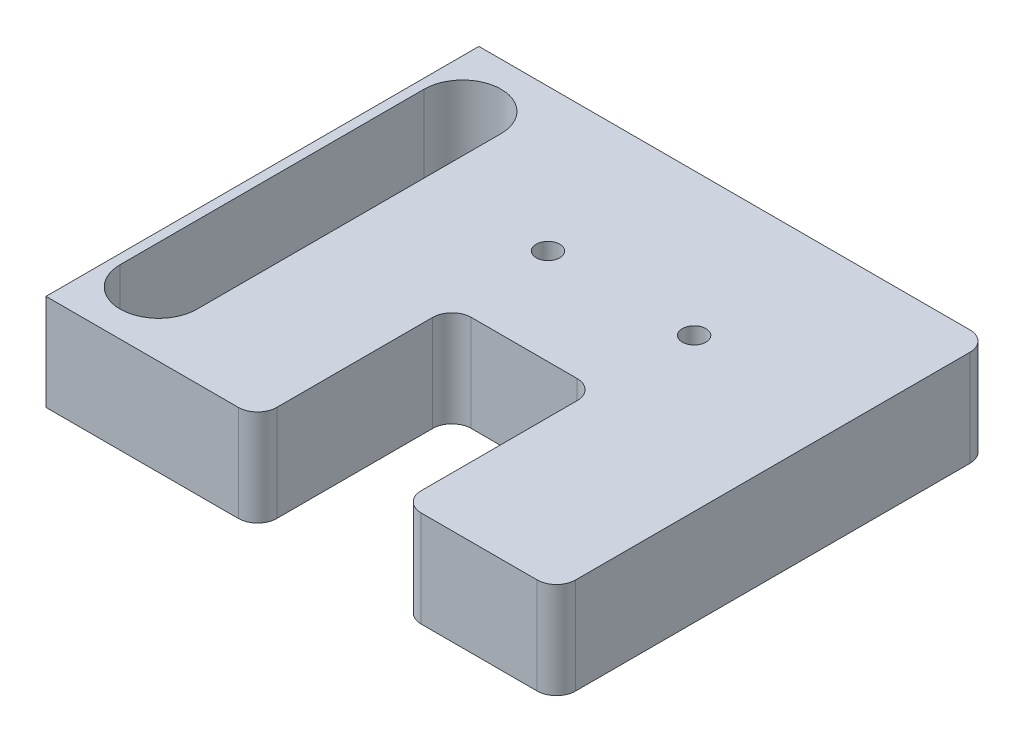
ISO-10303-21;
HEADER;
FILE_DESCRIPTION(('STEP AP214'),'2;1');
FILE_NAME('part.step','',(''),(''),'','','');
FILE_SCHEMA(('AUTOMOTIVE_DESIGN { 1 0 10303 214 1 1 1 1 }'));
ENDSEC;
DATA;
#1=APPLICATION_CONTEXT('core data for automotive mechanical design processes');
#2=APPLICATION_PROTOCOL_DEFINITION('international standard','automotive_design',2000,#1);
#3=PRODUCT_CONTEXT('',#1,'mechanical');
#4=PRODUCT('Part','Part','',(#3));
#5=PRODUCT_RELATED_PRODUCT_CATEGORY('part','',(#4));
#6=PRODUCT_DEFINITION_FORMATION('','',#4);
#7=PRODUCT_DEFINITION_CONTEXT('part definition',#1,'design');
#8=PRODUCT_DEFINITION('design','',#6,#7);
#9=PRODUCT_DEFINITION_SHAPE('','',#8);
#10=(LENGTH_UNIT() NAMED_UNIT(*) SI_UNIT(.MILLI.,.METRE.));
#11=(NAMED_UNIT(*) PLANE_ANGLE_UNIT() SI_UNIT($,.RADIAN.));
#12=(NAMED_UNIT(*) SI_UNIT($,.STERADIAN.) SOLID_ANGLE_UNIT());
#13=UNCERTAINTY_MEASURE_WITH_UNIT(LENGTH_MEASURE(1.E-05),#10,'distance_accuracy_value','');
#14=(GEOMETRIC_REPRESENTATION_CONTEXT(3) GLOBAL_UNCERTAINTY_ASSIGNED_CONTEXT((#13)) GLOBAL_UNIT_ASSIGNED_CONTEXT((#10,
#11,#12)) REPRESENTATION_CONTEXT('',''));
#15=CARTESIAN_POINT('',(0.,0.,0.));
#16=DIRECTION('',(0.,0.,1.));
#17=DIRECTION('',(1.,0.,0.));
#18=AXIS2_PLACEMENT_3D('',#15,#16,#17);
#19=CARTESIAN_POINT('',(-28.9537037037037,10.,44.98));
#20=DIRECTION('',(1.,0.,0.));
#21=DIRECTION('',(0.,0.,-1.));
#22=AXIS2_PLACEMENT_3D('',#19,#20,#21);
#23=PLANE('',#22);
#24=DIRECTION('',(0.,0.,1.));
#25=VECTOR('',#24,1.);
#26=CARTESIAN_POINT('',(-28.9537037037037,0.,44.98));
#27=LINE('',#26,#25);
#28=CARTESIAN_POINT('',(-28.9537037037037,0.,0.));
#29=VERTEX_POINT('',#28);
#30=CARTESIAN_POINT('',(-28.9537037037037,0.,44.98));
#31=VERTEX_POINT('',#30);
#32=EDGE_CURVE('E205',#29,#31,#27,.T.);
#33=ORIENTED_EDGE('',*,*,#32,.T.);
#34=DIRECTION('',(0.,-1.,0.));
#35=VECTOR('',#34,1.);
#36=CARTESIAN_POINT('',(-28.9537037037037,10.,44.98));
#37=LINE('',#36,#35);
#38=CARTESIAN_POINT('',(-28.9537037037037,10.,44.98));
#39=VERTEX_POINT('',#38);
#40=EDGE_CURVE('E250',#39,#31,#37,.T.);
#41=ORIENTED_EDGE('',*,*,#40,.F.);
#42=DIRECTION('',(0.,0.,1.));
#43=VECTOR('',#42,1.);
#44=CARTESIAN_POINT('',(-28.9537037037037,10.,44.98));
#45=LINE('',#44,#43);
#46=CARTESIAN_POINT('',(-28.9537037037037,10.,0.));
#47=VERTEX_POINT('',#46);
#48=EDGE_CURVE('E206',#47,#39,#45,.T.);
#49=ORIENTED_EDGE('',*,*,#48,.F.);
#50=DIRECTION('',(0.,-1.,0.));
#51=VECTOR('',#50,1.);
#52=CARTESIAN_POINT('',(-28.9537037037037,10.,0.));
#53=LINE('',#52,#51);
#54=EDGE_CURVE('E228',#47,#29,#53,.T.);
#55=ORIENTED_EDGE('',*,*,#54,.T.);
#56=EDGE_LOOP('',(#33,#41,#49,#55));
#57=FACE_BOUND('',#56,.T.);
#58=ADVANCED_FACE('F33',(#57),#23,.F.);
#59=CARTESIAN_POINT('',(-6.9737037037037,10.,44.98));
#60=DIRECTION('',(0.,0.,-1.));
#61=DIRECTION('',(-1.,0.,0.));
#62=AXIS2_PLACEMENT_3D('',#59,#60,#61);
#63=PLANE('',#62);
#64=DIRECTION('',(1.,0.,0.));
#65=VECTOR('',#64,1.);
#66=CARTESIAN_POINT('',(-6.9737037037037,0.,44.98));
#67=LINE('',#66,#65);
#68=CARTESIAN_POINT('',(-8.97370370370369,0.,44.98));
#69=VERTEX_POINT('',#68);
#70=EDGE_CURVE('E231',#31,#69,#67,.T.);
#71=ORIENTED_EDGE('',*,*,#70,.T.);
#72=DIRECTION('',(0.,-1.,0.));
#73=VECTOR('',#72,1.);
#74=CARTESIAN_POINT('',(-8.97370370370369,10.,44.98));
#75=LINE('',#74,#73);
#76=CARTESIAN_POINT('',(-8.97370370370369,10.,44.98));
#77=VERTEX_POINT('',#76);
#78=EDGE_CURVE('E278',#69,#77,#75,.F.);
#79=ORIENTED_EDGE('',*,*,#78,.T.);
#80=DIRECTION('',(1.,0.,0.));
#81=VECTOR('',#80,1.);
#82=CARTESIAN_POINT('',(-6.9737037037037,10.,44.98));
#83=LINE('',#82,#81);
#84=EDGE_CURVE('E209',#39,#77,#83,.T.);
#85=ORIENTED_EDGE('',*,*,#84,.F.);
#86=ORIENTED_EDGE('',*,*,#40,.T.);
#87=EDGE_LOOP('',(#71,#79,#85,#86));
#88=FACE_BOUND('',#87,.T.);
#89=ADVANCED_FACE('F376',(#88),#63,.F.);
#90=CARTESIAN_POINT('',(-6.9737037037037,10.,24.78));
#91=DIRECTION('',(-1.,0.,0.));
#92=DIRECTION('',(0.,0.,1.));
#93=AXIS2_PLACEMENT_3D('',#90,#91,#92);
#94=PLANE('',#93);
#95=DIRECTION('',(0.,0.,-1.));
#96=VECTOR('',#95,1.);
#97=CARTESIAN_POINT('',(-6.9737037037037,10.,24.78));
#98=LINE('',#97,#96);
#99=CARTESIAN_POINT('',(-6.9737037037037,10.,42.98));
#100=VERTEX_POINT('',#99);
#101=CARTESIAN_POINT('',(-6.9737037037037,10.,26.78));
#102=VERTEX_POINT('',#101);
#103=EDGE_CURVE('E213',#100,#102,#98,.T.);
#104=ORIENTED_EDGE('',*,*,#103,.F.);
#105=DIRECTION('',(0.,-1.,0.));
#106=VECTOR('',#105,1.);
#107=CARTESIAN_POINT('',(-6.9737037037037,10.,42.98));
#108=LINE('',#107,#106);
#109=CARTESIAN_POINT('',(-6.9737037037037,0.,42.98));
#110=VERTEX_POINT('',#109);
#111=EDGE_CURVE('E273',#100,#110,#108,.T.);
#112=ORIENTED_EDGE('',*,*,#111,.T.);
#113=DIRECTION('',(0.,0.,-1.));
#114=VECTOR('',#113,1.);
#115=CARTESIAN_POINT('',(-6.9737037037037,0.,24.78));
#116=LINE('',#115,#114);
#117=CARTESIAN_POINT('',(-6.9737037037037,0.,26.78));
#118=VERTEX_POINT('',#117);
#119=EDGE_CURVE('E234',#110,#118,#116,.T.);
#120=ORIENTED_EDGE('',*,*,#119,.T.);
#121=DIRECTION('',(0.,-1.,0.));
#122=VECTOR('',#121,1.);
#123=CARTESIAN_POINT('',(-6.9737037037037,10.,26.78));
#124=LINE('',#123,#122);
#125=EDGE_CURVE('E256',#118,#102,#124,.F.);
#126=ORIENTED_EDGE('',*,*,#125,.T.);
#127=EDGE_LOOP('',(#104,#112,#120,#126));
#128=FACE_BOUND('',#127,.T.);
#129=ADVANCED_FACE('F346',(#128),#94,.F.);
#130=CARTESIAN_POINT('',(8.0262962962963,10.,24.78));
#131=DIRECTION('',(0.,0.,-1.));
#132=DIRECTION('',(-1.,0.,0.));
#133=AXIS2_PLACEMENT_3D('',#130,#131,#132);
#134=PLANE('',#133);
#135=DIRECTION('',(1.,0.,0.));
#136=VECTOR('',#135,1.);
#137=CARTESIAN_POINT('',(8.0262962962963,0.,24.78));
#138=LINE('',#137,#136);
#139=CARTESIAN_POINT('',(-4.9737037037037,0.,24.78));
#140=VERTEX_POINT('',#139);
#141=CARTESIAN_POINT('',(6.0262962962963,0.,24.78));
#142=VERTEX_POINT('',#141);
#143=EDGE_CURVE('E236',#140,#142,#138,.T.);
#144=ORIENTED_EDGE('',*,*,#143,.T.);
#145=DIRECTION('',(0.,-1.,0.));
#146=VECTOR('',#145,1.);
#147=CARTESIAN_POINT('',(6.0262962962963,10.,24.78));
#148=LINE('',#147,#146);
#149=CARTESIAN_POINT('',(6.0262962962963,10.,24.78));
#150=VERTEX_POINT('',#149);
#151=EDGE_CURVE('E267',#142,#150,#148,.F.);
#152=ORIENTED_EDGE('',*,*,#151,.T.);
#153=DIRECTION('',(1.,0.,0.));
#154=VECTOR('',#153,1.);
#155=CARTESIAN_POINT('',(8.0262962962963,10.,24.78));
#156=LINE('',#155,#154);
#157=CARTESIAN_POINT('',(-4.9737037037037,10.,24.78));
#158=VERTEX_POINT('',#157);
#159=EDGE_CURVE('E215',#158,#150,#156,.T.);
#160=ORIENTED_EDGE('',*,*,#159,.F.);
#161=DIRECTION('',(0.,-1.,0.));
#162=VECTOR('',#161,1.);
#163=CARTESIAN_POINT('',(-4.9737037037037,0.,24.78));
#164=LINE('',#163,#162);
#165=EDGE_CURVE('E253',#158,#140,#164,.T.);
#166=ORIENTED_EDGE('',*,*,#165,.T.);
#167=EDGE_LOOP('',(#144,#152,#160,#166));
#168=FACE_BOUND('',#167,.T.);
#169=ADVANCED_FACE('F356',(#168),#134,.F.);
#170=CARTESIAN_POINT('',(8.0262962962963,10.,44.98));
#171=DIRECTION('',(1.,0.,0.));
#172=DIRECTION('',(0.,0.,-1.));
#173=AXIS2_PLACEMENT_3D('',#170,#171,#172);
#174=PLANE('',#173);
#175=DIRECTION('',(0.,0.,1.));
#176=VECTOR('',#175,1.);
#177=CARTESIAN_POINT('',(8.0262962962963,0.,44.98));
#178=LINE('',#177,#176);
#179=CARTESIAN_POINT('',(8.0262962962963,0.,26.78));
#180=VERTEX_POINT('',#179);
#181=CARTESIAN_POINT('',(8.0262962962963,0.,42.98));
#182=VERTEX_POINT('',#181);
#183=EDGE_CURVE('E239',#180,#182,#178,.T.);
#184=ORIENTED_EDGE('',*,*,#183,.T.);
#185=DIRECTION('',(0.,-1.,0.));
#186=VECTOR('',#185,1.);
#187=CARTESIAN_POINT('',(8.0262962962963,10.,42.98));
#188=LINE('',#187,#186);
#189=CARTESIAN_POINT('',(8.0262962962963,10.,42.98));
#190=VERTEX_POINT('',#189);
#191=EDGE_CURVE('E287',#182,#190,#188,.F.);
#192=ORIENTED_EDGE('',*,*,#191,.T.);
#193=DIRECTION('',(0.,0.,1.));
#194=VECTOR('',#193,1.);
#195=CARTESIAN_POINT('',(8.0262962962963,10.,44.98));
#196=LINE('',#195,#194);
#197=CARTESIAN_POINT('',(8.0262962962963,10.,26.78));
#198=VERTEX_POINT('',#197);
#199=EDGE_CURVE('E218',#198,#190,#196,.T.);
#200=ORIENTED_EDGE('',*,*,#199,.F.);
#201=DIRECTION('',(0.,-1.,0.));
#202=VECTOR('',#201,1.);
#203=CARTESIAN_POINT('',(8.0262962962963,0.,26.78));
#204=LINE('',#203,#202);
#205=EDGE_CURVE('E264',#198,#180,#204,.T.);
#206=ORIENTED_EDGE('',*,*,#205,.T.);
#207=EDGE_LOOP('',(#184,#192,#200,#206));
#208=FACE_BOUND('',#207,.T.);
#209=ADVANCED_FACE('F363',(#208),#174,.F.);
#210=CARTESIAN_POINT('',(24.0762962962963,10.,44.98));
#211=DIRECTION('',(0.,0.,-1.));
#212=DIRECTION('',(-1.,0.,0.));
#213=AXIS2_PLACEMENT_3D('',#210,#211,#212);
#214=PLANE('',#213);
#215=DIRECTION('',(1.,0.,0.));
#216=VECTOR('',#215,1.);
#217=CARTESIAN_POINT('',(24.0762962962963,0.,44.98));
#218=LINE('',#217,#216);
#219=CARTESIAN_POINT('',(10.0262962962963,0.,44.98));
#220=VERTEX_POINT('',#219);
#221=CARTESIAN_POINT('',(22.0762962962963,0.,44.98));
#222=VERTEX_POINT('',#221);
#223=EDGE_CURVE('E242',#220,#222,#218,.T.);
#224=ORIENTED_EDGE('',*,*,#223,.T.);
#225=DIRECTION('',(0.,-1.,0.));
#226=VECTOR('',#225,1.);
#227=CARTESIAN_POINT('',(22.0762962962963,10.,44.98));
#228=LINE('',#227,#226);
#229=CARTESIAN_POINT('',(22.0762962962963,10.,44.98));
#230=VERTEX_POINT('',#229);
#231=EDGE_CURVE('E41',#222,#230,#228,.F.);
#232=ORIENTED_EDGE('',*,*,#231,.T.);
#233=DIRECTION('',(1.,0.,0.));
#234=VECTOR('',#233,1.);
#235=CARTESIAN_POINT('',(24.0762962962963,10.,44.98));
#236=LINE('',#235,#234);
#237=CARTESIAN_POINT('',(10.0262962962963,10.,44.98));
#238=VERTEX_POINT('',#237);
#239=EDGE_CURVE('E221',#238,#230,#236,.T.);
#240=ORIENTED_EDGE('',*,*,#239,.F.);
#241=DIRECTION('',(0.,-1.,0.));
#242=VECTOR('',#241,1.);
#243=CARTESIAN_POINT('',(10.0262962962963,10.,44.98));
#244=LINE('',#243,#242);
#245=EDGE_CURVE('E282',#238,#220,#244,.T.);
#246=ORIENTED_EDGE('',*,*,#245,.T.);
#247=EDGE_LOOP('',(#224,#232,#240,#246));
#248=FACE_BOUND('',#247,.T.);
#249=ADVANCED_FACE('F309',(#248),#214,.F.);
#250=CARTESIAN_POINT('',(24.0762962962963,10.,0.));
#251=DIRECTION('',(-1.,0.,0.));
#252=DIRECTION('',(0.,0.,1.));
#253=AXIS2_PLACEMENT_3D('',#250,#251,#252);
#254=PLANE('',#253);
#255=DIRECTION('',(0.,0.,-1.));
#256=VECTOR('',#255,1.);
#257=CARTESIAN_POINT('',(24.0762962962963,10.,0.));
#258=LINE('',#257,#256);
#259=CARTESIAN_POINT('',(24.0762962962963,10.,42.98));
#260=VERTEX_POINT('',#259);
#261=CARTESIAN_POINT('',(24.0762962962963,10.,2.));
#262=VERTEX_POINT('',#261);
#263=EDGE_CURVE('E224',#260,#262,#258,.T.);
#264=ORIENTED_EDGE('',*,*,#263,.F.);
#265=DIRECTION('',(0.,-1.,0.));
#266=VECTOR('',#265,1.);
#267=CARTESIAN_POINT('',(24.0762962962963,10.,42.98));
#268=LINE('',#267,#266);
#269=CARTESIAN_POINT('',(24.0762962962963,0.,42.98));
#270=VERTEX_POINT('',#269);
#271=EDGE_CURVE('E302',#260,#270,#268,.T.);
#272=ORIENTED_EDGE('',*,*,#271,.T.);
#273=DIRECTION('',(0.,0.,-1.));
#274=VECTOR('',#273,1.);
#275=CARTESIAN_POINT('',(24.0762962962963,0.,0.));
#276=LINE('',#275,#274);
#277=CARTESIAN_POINT('',(24.0762962962963,0.,2.));
#278=VERTEX_POINT('',#277);
#279=EDGE_CURVE('E245',#270,#278,#276,.T.);
#280=ORIENTED_EDGE('',*,*,#279,.T.);
#281=DIRECTION('',(0.,-1.,0.));
#282=VECTOR('',#281,1.);
#283=CARTESIAN_POINT('',(24.0762962962963,10.,2.));
#284=LINE('',#283,#282);
#285=EDGE_CURVE('E297',#278,#262,#284,.F.);
#286=ORIENTED_EDGE('',*,*,#285,.T.);
#287=EDGE_LOOP('',(#264,#272,#280,#286));
#288=FACE_BOUND('',#287,.T.);
#289=ADVANCED_FACE('F321',(#288),#254,.F.);
#290=CARTESIAN_POINT('',(-28.9537037037037,10.,0.));
#291=DIRECTION('',(0.,0.,1.));
#292=DIRECTION('',(1.,0.,0.));
#293=AXIS2_PLACEMENT_3D('',#290,#291,#292);
#294=PLANE('',#293);
#295=DIRECTION('',(-1.,0.,0.));
#296=VECTOR('',#295,1.);
#297=CARTESIAN_POINT('',(-28.9537037037037,10.,0.));
#298=LINE('',#297,#296);
#299=CARTESIAN_POINT('',(22.0762962962963,10.,0.));
#300=VERTEX_POINT('',#299);
#301=EDGE_CURVE('E226',#300,#47,#298,.T.);
#302=ORIENTED_EDGE('',*,*,#301,.F.);
#303=DIRECTION('',(0.,-1.,0.));
#304=VECTOR('',#303,1.);
#305=CARTESIAN_POINT('',(22.0762962962963,10.,0.));
#306=LINE('',#305,#304);
#307=CARTESIAN_POINT('',(22.0762962962963,0.,0.));
#308=VERTEX_POINT('',#307);
#309=EDGE_CURVE('E291',#300,#308,#306,.T.);
#310=ORIENTED_EDGE('',*,*,#309,.T.);
#311=DIRECTION('',(-1.,0.,0.));
#312=VECTOR('',#311,1.);
#313=CARTESIAN_POINT('',(-28.9537037037037,0.,0.));
#314=LINE('',#313,#312);
#315=EDGE_CURVE('E210',#308,#29,#314,.T.);
#316=ORIENTED_EDGE('',*,*,#315,.T.);
#317=ORIENTED_EDGE('',*,*,#54,.F.);
#318=EDGE_LOOP('',(#302,#310,#316,#317));
#319=FACE_BOUND('',#318,.T.);
#320=ADVANCED_FACE('F333',(#319),#294,.F.);
#321=CARTESIAN_POINT('',(0.,10.,0.));
#322=DIRECTION('',(0.,-1.,0.));
#323=DIRECTION('',(0.,0.,-1.));
#324=AXIS2_PLACEMENT_3D('',#321,#322,#323);
#325=PLANE('',#324);
#326=DIRECTION('',(0.,0.,-1.));
#327=VECTOR('',#326,1.);
#328=CARTESIAN_POINT('',(-19.9537037037037,10.,6.7));
#329=LINE('',#328,#327);
#330=CARTESIAN_POINT('',(-19.9537037037037,10.,38.28));
#331=VERTEX_POINT('',#330);
#332=CARTESIAN_POINT('',(-19.9537037037037,10.,6.7));
#333=VERTEX_POINT('',#332);
#334=EDGE_CURVE('E184',#331,#333,#329,.T.);
#335=ORIENTED_EDGE('',*,*,#334,.F.);
#336=CARTESIAN_POINT('',(-23.9537037037037,10.,38.28));
#337=DIRECTION('',(0.,1.,0.));
#338=DIRECTION('',(0.,0.,1.));
#339=AXIS2_PLACEMENT_3D('',#336,#337,#338);
#340=CIRCLE('',#339,4.);
#341=CARTESIAN_POINT('',(-27.9537037037037,10.,38.28));
#342=VERTEX_POINT('',#341);
#343=EDGE_CURVE('E48',#342,#331,#340,.T.);
#344=ORIENTED_EDGE('',*,*,#343,.F.);
#345=DIRECTION('',(0.,0.,1.));
#346=VECTOR('',#345,1.);
#347=CARTESIAN_POINT('',(-27.9537037037037,10.,6.7));
#348=LINE('',#347,#346);
#349=CARTESIAN_POINT('',(-27.9537037037037,10.,6.7));
#350=VERTEX_POINT('',#349);
#351=EDGE_CURVE('E175',#350,#342,#348,.T.);
#352=ORIENTED_EDGE('',*,*,#351,.F.);
#353=CARTESIAN_POINT('',(-23.9537037037037,10.,6.7));
#354=DIRECTION('',(0.,1.,0.));
#355=DIRECTION('',(0.,0.,-1.));
#356=AXIS2_PLACEMENT_3D('',#353,#354,#355);
#357=CIRCLE('',#356,4.);
#358=EDGE_CURVE('E178',#333,#350,#357,.T.);
#359=ORIENTED_EDGE('',*,*,#358,.F.);
#360=EDGE_LOOP('',(#335,#344,#352,#359));
#361=FACE_BOUND('',#360,.T.);
#362=CARTESIAN_POINT('',(-6.9587037037037,10.,14.825));
#363=DIRECTION('',(0.,-1.,0.));
#364=DIRECTION('',(0.,0.,-1.));
#365=AXIS2_PLACEMENT_3D('',#362,#363,#364);
#366=CIRCLE('',#365,1.225);
#367=CARTESIAN_POINT('',(-6.9587037037037,10.,13.6));
#368=VERTEX_POINT('',#367);
#369=EDGE_CURVE('E202',#368,#368,#366,.T.);
#370=ORIENTED_EDGE('',*,*,#369,.T.);
#371=EDGE_LOOP('',(#370));
#372=FACE_BOUND('',#371,.T.);
#373=CARTESIAN_POINT('',(8.2312962962963,10.,14.825));
#374=DIRECTION('',(0.,-1.,0.));
#375=DIRECTION('',(0.,0.,-1.));
#376=AXIS2_PLACEMENT_3D('',#373,#374,#375);
#377=CIRCLE('',#376,1.225);
#378=CARTESIAN_POINT('',(8.2312962962963,10.,13.6));
#379=VERTEX_POINT('',#378);
#380=EDGE_CURVE('E197',#379,#379,#377,.T.);
#381=ORIENTED_EDGE('',*,*,#380,.T.);
#382=EDGE_LOOP('',(#381));
#383=FACE_BOUND('',#382,.T.);
#384=ORIENTED_EDGE('',*,*,#239,.T.);
#385=CARTESIAN_POINT('',(22.0762962962963,10.,42.98));
#386=DIRECTION('',(0.,-1.,0.));
#387=DIRECTION('',(0.,0.,-1.));
#388=AXIS2_PLACEMENT_3D('',#385,#386,#387);
#389=CIRCLE('',#388,2.);
#390=EDGE_CURVE('E11',#230,#260,#389,.F.);
#391=ORIENTED_EDGE('',*,*,#390,.T.);
#392=ORIENTED_EDGE('',*,*,#263,.T.);
#393=CARTESIAN_POINT('',(22.0762962962963,10.,2.));
#394=DIRECTION('',(0.,-1.,0.));
#395=DIRECTION('',(0.,0.,-1.));
#396=AXIS2_PLACEMENT_3D('',#393,#394,#395);
#397=CIRCLE('',#396,2.);
#398=EDGE_CURVE('E300',#262,#300,#397,.F.);
#399=ORIENTED_EDGE('',*,*,#398,.T.);
#400=ORIENTED_EDGE('',*,*,#301,.T.);
#401=ORIENTED_EDGE('',*,*,#48,.T.);
#402=ORIENTED_EDGE('',*,*,#84,.T.);
#403=CARTESIAN_POINT('',(-8.97370370370369,10.,42.98));
#404=DIRECTION('',(0.,-1.,0.));
#405=DIRECTION('',(0.,0.,-1.));
#406=AXIS2_PLACEMENT_3D('',#403,#404,#405);
#407=CIRCLE('',#406,2.);
#408=EDGE_CURVE('E280',#77,#100,#407,.F.);
#409=ORIENTED_EDGE('',*,*,#408,.T.);
#410=ORIENTED_EDGE('',*,*,#103,.T.);
#411=CARTESIAN_POINT('',(-4.9737037037037,10.,26.78));
#412=DIRECTION('',(0.,-1.,0.));
#413=DIRECTION('',(0.,0.,-1.));
#414=AXIS2_PLACEMENT_3D('',#411,#412,#413);
#415=CIRCLE('',#414,2.);
#416=EDGE_CURVE('E262',#102,#158,#415,.T.);
#417=ORIENTED_EDGE('',*,*,#416,.T.);
#418=ORIENTED_EDGE('',*,*,#159,.T.);
#419=CARTESIAN_POINT('',(6.0262962962963,10.,26.78));
#420=DIRECTION('',(0.,-1.,0.));
#421=DIRECTION('',(0.,0.,-1.));
#422=AXIS2_PLACEMENT_3D('',#419,#420,#421);
#423=CIRCLE('',#422,2.);
#424=EDGE_CURVE('E271',#150,#198,#423,.T.);
#425=ORIENTED_EDGE('',*,*,#424,.T.);
#426=ORIENTED_EDGE('',*,*,#199,.T.);
#427=CARTESIAN_POINT('',(10.0262962962963,10.,42.98));
#428=DIRECTION('',(0.,-1.,0.));
#429=DIRECTION('',(0.,0.,-1.));
#430=AXIS2_PLACEMENT_3D('',#427,#428,#429);
#431=CIRCLE('',#430,2.);
#432=EDGE_CURVE('E289',#190,#238,#431,.F.);
#433=ORIENTED_EDGE('',*,*,#432,.T.);
#434=EDGE_LOOP('',(#384,#391,#392,#399,#400,#401,#402,#409,#410,#417,#418,#425,#426,#433));
#435=FACE_BOUND('',#434,.T.);
#436=ADVANCED_FACE('F315',(#361,#372,#383,#435),#325,.F.);
#437=CARTESIAN_POINT('',(0.,0.,0.));
#438=DIRECTION('',(0.,-1.,0.));
#439=DIRECTION('',(0.,0.,-1.));
#440=AXIS2_PLACEMENT_3D('',#437,#438,#439);
#441=PLANE('',#440);
#442=CARTESIAN_POINT('',(-23.9537037037037,0.,38.28));
#443=DIRECTION('',(0.,1.,0.));
#444=DIRECTION('',(0.,0.,1.));
#445=AXIS2_PLACEMENT_3D('',#442,#443,#444);
#446=CIRCLE('',#445,4.);
#447=CARTESIAN_POINT('',(-27.9537037037037,0.,38.28));
#448=VERTEX_POINT('',#447);
#449=CARTESIAN_POINT('',(-19.9537037037037,0.,38.28));
#450=VERTEX_POINT('',#449);
#451=EDGE_CURVE('E159',#448,#450,#446,.T.);
#452=ORIENTED_EDGE('',*,*,#451,.T.);
#453=DIRECTION('',(0.,0.,-1.));
#454=VECTOR('',#453,1.);
#455=CARTESIAN_POINT('',(-19.9537037037037,0.,6.7));
#456=LINE('',#455,#454);
#457=CARTESIAN_POINT('',(-19.9537037037037,0.,6.7));
#458=VERTEX_POINT('',#457);
#459=EDGE_CURVE('E168',#450,#458,#456,.T.);
#460=ORIENTED_EDGE('',*,*,#459,.T.);
#461=CARTESIAN_POINT('',(-23.9537037037037,0.,6.7));
#462=DIRECTION('',(0.,1.,0.));
#463=DIRECTION('',(0.,0.,-1.));
#464=AXIS2_PLACEMENT_3D('',#461,#462,#463);
#465=CIRCLE('',#464,4.);
#466=CARTESIAN_POINT('',(-27.9537037037037,0.,6.7));
#467=VERTEX_POINT('',#466);
#468=EDGE_CURVE('E56',#458,#467,#465,.T.);
#469=ORIENTED_EDGE('',*,*,#468,.T.);
#470=DIRECTION('',(0.,0.,1.));
#471=VECTOR('',#470,1.);
#472=CARTESIAN_POINT('',(-27.9537037037037,0.,6.7));
#473=LINE('',#472,#471);
#474=EDGE_CURVE('E165',#467,#448,#473,.T.);
#475=ORIENTED_EDGE('',*,*,#474,.T.);
#476=EDGE_LOOP('',(#452,#460,#469,#475));
#477=FACE_BOUND('',#476,.T.);
#478=CARTESIAN_POINT('',(-6.9587037037037,0.,14.825));
#479=DIRECTION('',(0.,1.,0.));
#480=DIRECTION('',(0.,0.,1.));
#481=AXIS2_PLACEMENT_3D('',#478,#479,#480);
#482=CIRCLE('',#481,1.225);
#483=CARTESIAN_POINT('',(-6.9587037037037,0.,16.05));
#484=VERTEX_POINT('',#483);
#485=EDGE_CURVE('E194',#484,#484,#482,.T.);
#486=ORIENTED_EDGE('',*,*,#485,.T.);
#487=EDGE_LOOP('',(#486));
#488=FACE_BOUND('',#487,.T.);
#489=CARTESIAN_POINT('',(8.2312962962963,0.,14.825));
#490=DIRECTION('',(0.,1.,0.));
#491=DIRECTION('',(0.,0.,1.));
#492=AXIS2_PLACEMENT_3D('',#489,#490,#491);
#493=CIRCLE('',#492,1.225);
#494=CARTESIAN_POINT('',(8.2312962962963,0.,16.05));
#495=VERTEX_POINT('',#494);
#496=EDGE_CURVE('E190',#495,#495,#493,.T.);
#497=ORIENTED_EDGE('',*,*,#496,.T.);
#498=EDGE_LOOP('',(#497));
#499=FACE_BOUND('',#498,.T.);
#500=ORIENTED_EDGE('',*,*,#279,.F.);
#501=CARTESIAN_POINT('',(22.0762962962963,0.,42.98));
#502=DIRECTION('',(0.,-1.,0.));
#503=DIRECTION('',(0.,0.,-1.));
#504=AXIS2_PLACEMENT_3D('',#501,#502,#503);
#505=CIRCLE('',#504,2.);
#506=EDGE_CURVE('E305',#270,#222,#505,.T.);
#507=ORIENTED_EDGE('',*,*,#506,.T.);
#508=ORIENTED_EDGE('',*,*,#223,.F.);
#509=CARTESIAN_POINT('',(10.0262962962963,0.,42.98));
#510=DIRECTION('',(0.,-1.,0.));
#511=DIRECTION('',(0.,0.,-1.));
#512=AXIS2_PLACEMENT_3D('',#509,#510,#511);
#513=CIRCLE('',#512,2.);
#514=EDGE_CURVE('E285',#220,#182,#513,.T.);
#515=ORIENTED_EDGE('',*,*,#514,.T.);
#516=ORIENTED_EDGE('',*,*,#183,.F.);
#517=CARTESIAN_POINT('',(6.0262962962963,0.,26.78));
#518=DIRECTION('',(0.,-1.,0.));
#519=DIRECTION('',(0.,0.,-1.));
#520=AXIS2_PLACEMENT_3D('',#517,#518,#519);
#521=CIRCLE('',#520,2.);
#522=EDGE_CURVE('E269',#180,#142,#521,.F.);
#523=ORIENTED_EDGE('',*,*,#522,.T.);
#524=ORIENTED_EDGE('',*,*,#143,.F.);
#525=CARTESIAN_POINT('',(-4.9737037037037,0.,26.78));
#526=DIRECTION('',(0.,-1.,0.));
#527=DIRECTION('',(0.,0.,-1.));
#528=AXIS2_PLACEMENT_3D('',#525,#526,#527);
#529=CIRCLE('',#528,2.);
#530=EDGE_CURVE('E259',#140,#118,#529,.F.);
#531=ORIENTED_EDGE('',*,*,#530,.T.);
#532=ORIENTED_EDGE('',*,*,#119,.F.);
#533=CARTESIAN_POINT('',(-8.97370370370369,0.,42.98));
#534=DIRECTION('',(0.,-1.,0.));
#535=DIRECTION('',(0.,0.,-1.));
#536=AXIS2_PLACEMENT_3D('',#533,#534,#535);
#537=CIRCLE('',#536,2.);
#538=EDGE_CURVE('E276',#110,#69,#537,.T.);
#539=ORIENTED_EDGE('',*,*,#538,.T.);
#540=ORIENTED_EDGE('',*,*,#70,.F.);
#541=ORIENTED_EDGE('',*,*,#32,.F.);
#542=ORIENTED_EDGE('',*,*,#315,.F.);
#543=CARTESIAN_POINT('',(22.0762962962963,0.,2.));
#544=DIRECTION('',(0.,-1.,0.));
#545=DIRECTION('',(0.,0.,-1.));
#546=AXIS2_PLACEMENT_3D('',#543,#544,#545);
#547=CIRCLE('',#546,2.);
#548=EDGE_CURVE('E294',#308,#278,#547,.T.);
#549=ORIENTED_EDGE('',*,*,#548,.T.);
#550=EDGE_LOOP('',(#500,#507,#508,#515,#516,#523,#524,#531,#532,#539,#540,#541,#542,#549));
#551=FACE_BOUND('',#550,.T.);
#552=ADVANCED_FACE('F172',(#477,#488,#499,#551),#441,.T.);
#553=CARTESIAN_POINT('',(-4.9737037037037,10.,26.78));
#554=DIRECTION('',(0.,1.,0.));
#555=DIRECTION('',(0.,0.,1.));
#556=AXIS2_PLACEMENT_3D('',#553,#554,#555);
#557=CYLINDRICAL_SURFACE('',#556,2.);
#558=ORIENTED_EDGE('',*,*,#416,.F.);
#559=ORIENTED_EDGE('',*,*,#125,.F.);
#560=ORIENTED_EDGE('',*,*,#530,.F.);
#561=ORIENTED_EDGE('',*,*,#165,.F.);
#562=EDGE_LOOP('',(#558,#559,#560,#561));
#563=FACE_BOUND('',#562,.T.);
#564=ADVANCED_FACE('F352',(#563),#557,.F.);
#565=CARTESIAN_POINT('',(6.0262962962963,10.,26.78));
#566=DIRECTION('',(0.,1.,0.));
#567=DIRECTION('',(0.,0.,1.));
#568=AXIS2_PLACEMENT_3D('',#565,#566,#567);
#569=CYLINDRICAL_SURFACE('',#568,2.);
#570=ORIENTED_EDGE('',*,*,#424,.F.);
#571=ORIENTED_EDGE('',*,*,#151,.F.);
#572=ORIENTED_EDGE('',*,*,#522,.F.);
#573=ORIENTED_EDGE('',*,*,#205,.F.);
#574=EDGE_LOOP('',(#570,#571,#572,#573));
#575=FACE_BOUND('',#574,.T.);
#576=ADVANCED_FACE('F359',(#575),#569,.F.);
#577=CARTESIAN_POINT('',(-8.97370370370369,10.,42.98));
#578=DIRECTION('',(0.,-1.,0.));
#579=DIRECTION('',(0.,0.,-1.));
#580=AXIS2_PLACEMENT_3D('',#577,#578,#579);
#581=CYLINDRICAL_SURFACE('',#580,2.);
#582=ORIENTED_EDGE('',*,*,#408,.F.);
#583=ORIENTED_EDGE('',*,*,#78,.F.);
#584=ORIENTED_EDGE('',*,*,#538,.F.);
#585=ORIENTED_EDGE('',*,*,#111,.F.);
#586=EDGE_LOOP('',(#582,#583,#584,#585));
#587=FACE_BOUND('',#586,.T.);
#588=ADVANCED_FACE('F343',(#587),#581,.T.);
#589=CARTESIAN_POINT('',(10.0262962962963,10.,42.98));
#590=DIRECTION('',(0.,-1.,0.));
#591=DIRECTION('',(0.,0.,-1.));
#592=AXIS2_PLACEMENT_3D('',#589,#590,#591);
#593=CYLINDRICAL_SURFACE('',#592,2.);
#594=ORIENTED_EDGE('',*,*,#432,.F.);
#595=ORIENTED_EDGE('',*,*,#191,.F.);
#596=ORIENTED_EDGE('',*,*,#514,.F.);
#597=ORIENTED_EDGE('',*,*,#245,.F.);
#598=EDGE_LOOP('',(#594,#595,#596,#597));
#599=FACE_BOUND('',#598,.T.);
#600=ADVANCED_FACE('F367',(#599),#593,.T.);
#601=CARTESIAN_POINT('',(22.0762962962963,10.,2.));
#602=DIRECTION('',(0.,-1.,0.));
#603=DIRECTION('',(0.,0.,-1.));
#604=AXIS2_PLACEMENT_3D('',#601,#602,#603);
#605=CYLINDRICAL_SURFACE('',#604,2.);
#606=ORIENTED_EDGE('',*,*,#398,.F.);
#607=ORIENTED_EDGE('',*,*,#285,.F.);
#608=ORIENTED_EDGE('',*,*,#548,.F.);
#609=ORIENTED_EDGE('',*,*,#309,.F.);
#610=EDGE_LOOP('',(#606,#607,#608,#609));
#611=FACE_BOUND('',#610,.T.);
#612=ADVANCED_FACE('F329',(#611),#605,.T.);
#613=CARTESIAN_POINT('',(22.0762962962963,10.,42.98));
#614=DIRECTION('',(0.,-1.,0.));
#615=DIRECTION('',(0.,0.,-1.));
#616=AXIS2_PLACEMENT_3D('',#613,#614,#615);
#617=CYLINDRICAL_SURFACE('',#616,2.);
#618=ORIENTED_EDGE('',*,*,#390,.F.);
#619=ORIENTED_EDGE('',*,*,#231,.F.);
#620=ORIENTED_EDGE('',*,*,#506,.F.);
#621=ORIENTED_EDGE('',*,*,#271,.F.);
#622=EDGE_LOOP('',(#618,#619,#620,#621));
#623=FACE_BOUND('',#622,.T.);
#624=ADVANCED_FACE('F35',(#623),#617,.T.);
#625=CARTESIAN_POINT('',(8.2312962962963,0.,14.825));
#626=DIRECTION('',(0.,1.,0.));
#627=DIRECTION('',(0.,0.,1.));
#628=AXIS2_PLACEMENT_3D('',#625,#626,#627);
#629=CYLINDRICAL_SURFACE('',#628,1.225);
#630=ORIENTED_EDGE('',*,*,#496,.F.);
#631=EDGE_LOOP('',(#630));
#632=FACE_BOUND('',#631,.T.);
#633=ORIENTED_EDGE('',*,*,#380,.F.);
#634=EDGE_LOOP('',(#633));
#635=FACE_BOUND('',#634,.T.);
#636=ADVANCED_FACE('F457',(#632,#635),#629,.F.);
#637=CARTESIAN_POINT('',(-6.9587037037037,0.,14.825));
#638=DIRECTION('',(0.,1.,0.));
#639=DIRECTION('',(0.,0.,1.));
#640=AXIS2_PLACEMENT_3D('',#637,#638,#639);
#641=CYLINDRICAL_SURFACE('',#640,1.225);
#642=ORIENTED_EDGE('',*,*,#485,.F.);
#643=EDGE_LOOP('',(#642));
#644=FACE_BOUND('',#643,.T.);
#645=ORIENTED_EDGE('',*,*,#369,.F.);
#646=EDGE_LOOP('',(#645));
#647=FACE_BOUND('',#646,.T.);
#648=ADVANCED_FACE('F465',(#644,#647),#641,.F.);
#649=CARTESIAN_POINT('',(-23.9537037037037,0.,38.28));
#650=DIRECTION('',(0.,1.,0.));
#651=DIRECTION('',(0.,0.,1.));
#652=AXIS2_PLACEMENT_3D('',#649,#650,#651);
#653=CYLINDRICAL_SURFACE('',#652,4.);
#654=ORIENTED_EDGE('',*,*,#343,.T.);
#655=DIRECTION('',(0.,1.,0.));
#656=VECTOR('',#655,1.);
#657=CARTESIAN_POINT('',(-19.9537037037037,0.,38.28));
#658=LINE('',#657,#656);
#659=EDGE_CURVE('E155',#450,#331,#658,.T.);
#660=ORIENTED_EDGE('',*,*,#659,.F.);
#661=ORIENTED_EDGE('',*,*,#451,.F.);
#662=DIRECTION('',(0.,1.,0.));
#663=VECTOR('',#662,1.);
#664=CARTESIAN_POINT('',(-27.9537037037037,0.,38.28));
#665=LINE('',#664,#663);
#666=EDGE_CURVE('E188',#448,#342,#665,.T.);
#667=ORIENTED_EDGE('',*,*,#666,.T.);
#668=EDGE_LOOP('',(#654,#660,#661,#667));
#669=FACE_BOUND('',#668,.T.);
#670=ADVANCED_FACE('F157',(#669),#653,.F.);
#671=CARTESIAN_POINT('',(-27.9537037037037,0.,6.7));
#672=DIRECTION('',(-1.,0.,0.));
#673=DIRECTION('',(0.,0.,1.));
#674=AXIS2_PLACEMENT_3D('',#671,#672,#673);
#675=PLANE('',#674);
#676=ORIENTED_EDGE('',*,*,#351,.T.);
#677=ORIENTED_EDGE('',*,*,#666,.F.);
#678=ORIENTED_EDGE('',*,*,#474,.F.);
#679=DIRECTION('',(0.,1.,0.));
#680=VECTOR('',#679,1.);
#681=CARTESIAN_POINT('',(-27.9537037037037,0.,6.7));
#682=LINE('',#681,#680);
#683=EDGE_CURVE('E191',#467,#350,#682,.T.);
#684=ORIENTED_EDGE('',*,*,#683,.T.);
#685=EDGE_LOOP('',(#676,#677,#678,#684));
#686=FACE_BOUND('',#685,.T.);
#687=ADVANCED_FACE('F499',(#686),#675,.F.);
#688=CARTESIAN_POINT('',(-23.9537037037037,0.,6.7));
#689=DIRECTION('',(0.,1.,0.));
#690=DIRECTION('',(0.,0.,1.));
#691=AXIS2_PLACEMENT_3D('',#688,#689,#690);
#692=CYLINDRICAL_SURFACE('',#691,4.);
#693=ORIENTED_EDGE('',*,*,#358,.T.);
#694=ORIENTED_EDGE('',*,*,#683,.F.);
#695=ORIENTED_EDGE('',*,*,#468,.F.);
#696=DIRECTION('',(0.,1.,0.));
#697=VECTOR('',#696,1.);
#698=CARTESIAN_POINT('',(-19.9537037037037,0.,6.7));
#699=LINE('',#698,#697);
#700=EDGE_CURVE('E164',#458,#333,#699,.T.);
#701=ORIENTED_EDGE('',*,*,#700,.T.);
#702=EDGE_LOOP('',(#693,#694,#695,#701));
#703=FACE_BOUND('',#702,.T.);
#704=ADVANCED_FACE('F508',(#703),#692,.F.);
#705=CARTESIAN_POINT('',(-19.9537037037037,0.,6.7));
#706=DIRECTION('',(1.,0.,0.));
#707=DIRECTION('',(0.,0.,-1.));
#708=AXIS2_PLACEMENT_3D('',#705,#706,#707);
#709=PLANE('',#708);
#710=ORIENTED_EDGE('',*,*,#334,.T.);
#711=ORIENTED_EDGE('',*,*,#700,.F.);
#712=ORIENTED_EDGE('',*,*,#459,.F.);
#713=ORIENTED_EDGE('',*,*,#659,.T.);
#714=EDGE_LOOP('',(#710,#711,#712,#713));
#715=FACE_BOUND('',#714,.T.);
#716=ADVANCED_FACE('F169',(#715),#709,.F.);
#717=CLOSED_SHELL('',(#58,#89,#129,#169,#209,#249,#289,#320,#436,#552,#564,#576,#588,#600,#612,
#624,#636,#648,#670,#687,#704,#716));
#718=MANIFOLD_SOLID_BREP('B2',#717);
#719=ADVANCED_BREP_SHAPE_REPRESENTATION('',(#18,#718),#14);
#720=SHAPE_DEFINITION_REPRESENTATION(#9,#719);
ENDSEC;
END-ISO-10303-21;
